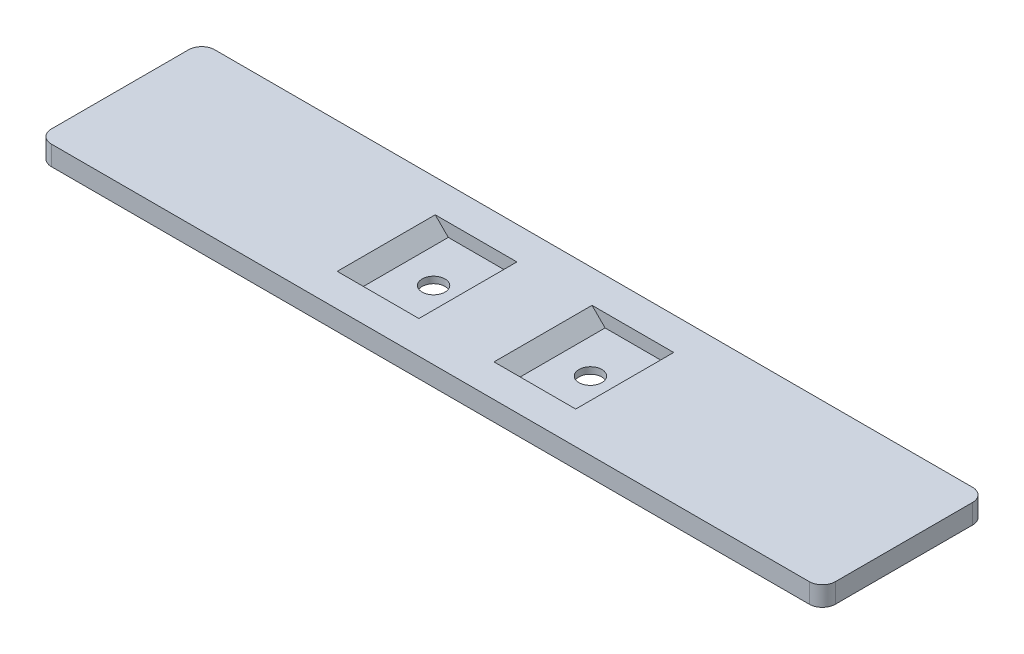
ISO-10303-21;
HEADER;
FILE_DESCRIPTION(('STEP AP214'),'2;1');
FILE_NAME('part.step','',(''),(''),'','','');
FILE_SCHEMA(('AUTOMOTIVE_DESIGN { 1 0 10303 214 1 1 1 1 }'));
ENDSEC;
DATA;
#1=APPLICATION_CONTEXT('core data for automotive mechanical design processes');
#2=APPLICATION_PROTOCOL_DEFINITION('international standard','automotive_design',2000,#1);
#3=PRODUCT_CONTEXT('',#1,'mechanical');
#4=PRODUCT('Part','Part','',(#3));
#5=PRODUCT_RELATED_PRODUCT_CATEGORY('part','',(#4));
#6=PRODUCT_DEFINITION_FORMATION('','',#4);
#7=PRODUCT_DEFINITION_CONTEXT('part definition',#1,'design');
#8=PRODUCT_DEFINITION('design','',#6,#7);
#9=PRODUCT_DEFINITION_SHAPE('','',#8);
#10=(LENGTH_UNIT() NAMED_UNIT(*) SI_UNIT(.MILLI.,.METRE.));
#11=(NAMED_UNIT(*) PLANE_ANGLE_UNIT() SI_UNIT($,.RADIAN.));
#12=(NAMED_UNIT(*) SI_UNIT($,.STERADIAN.) SOLID_ANGLE_UNIT());
#13=UNCERTAINTY_MEASURE_WITH_UNIT(LENGTH_MEASURE(1.E-05),#10,'distance_accuracy_value','');
#14=(GEOMETRIC_REPRESENTATION_CONTEXT(3) GLOBAL_UNCERTAINTY_ASSIGNED_CONTEXT((#13)) GLOBAL_UNIT_ASSIGNED_CONTEXT((#10,
#11,#12)) REPRESENTATION_CONTEXT('',''));
#15=CARTESIAN_POINT('',(0.,0.,0.));
#16=DIRECTION('',(0.,0.,1.));
#17=DIRECTION('',(1.,0.,0.));
#18=AXIS2_PLACEMENT_3D('',#15,#16,#17);
#19=CARTESIAN_POINT('',(-17.25,1.,7.5));
#20=DIRECTION('',(0.,0.,1.));
#21=DIRECTION('',(1.,0.,0.));
#22=AXIS2_PLACEMENT_3D('',#19,#20,#21);
#23=PLANE('',#22);
#24=DIRECTION('',(0.707106781186546,-0.70710678118655,0.));
#25=VECTOR('',#24,1.);
#26=CARTESIAN_POINT('',(-19.25,3.,7.5));
#27=LINE('',#26,#25);
#28=CARTESIAN_POINT('',(-19.25,3.,7.5));
#29=VERTEX_POINT('',#28);
#30=CARTESIAN_POINT('',(-17.25,1.,7.5));
#31=VERTEX_POINT('',#30);
#32=EDGE_CURVE('E50',#29,#31,#27,.T.);
#33=ORIENTED_EDGE('',*,*,#32,.F.);
#34=DIRECTION('',(1.,0.,0.));
#35=VECTOR('',#34,1.);
#36=CARTESIAN_POINT('',(-17.25,3.,7.5));
#37=LINE('',#36,#35);
#38=CARTESIAN_POINT('',(-6.75,3.,7.5));
#39=VERTEX_POINT('',#38);
#40=EDGE_CURVE('E191',#29,#39,#37,.T.);
#41=ORIENTED_EDGE('',*,*,#40,.T.);
#42=DIRECTION('',(0.,1.,0.));
#43=VECTOR('',#42,1.);
#44=CARTESIAN_POINT('',(-6.75,1.,7.5));
#45=LINE('',#44,#43);
#46=CARTESIAN_POINT('',(-6.75,1.,7.5));
#47=VERTEX_POINT('',#46);
#48=EDGE_CURVE('E200',#47,#39,#45,.T.);
#49=ORIENTED_EDGE('',*,*,#48,.F.);
#50=DIRECTION('',(1.,0.,0.));
#51=VECTOR('',#50,1.);
#52=CARTESIAN_POINT('',(-17.25,1.,7.5));
#53=LINE('',#52,#51);
#54=EDGE_CURVE('E194',#31,#47,#53,.T.);
#55=ORIENTED_EDGE('',*,*,#54,.F.);
#56=EDGE_LOOP('',(#33,#41,#49,#55));
#57=FACE_BOUND('',#56,.T.);
#58=ADVANCED_FACE('F35',(#57),#23,.F.);
#59=CARTESIAN_POINT('',(-17.25,1.,-7.5));
#60=DIRECTION('',(0.,0.,-1.));
#61=DIRECTION('',(-1.,0.,0.));
#62=AXIS2_PLACEMENT_3D('',#59,#60,#61);
#63=PLANE('',#62);
#64=DIRECTION('',(0.707106781186546,-0.70710678118655,0.));
#65=VECTOR('',#64,1.);
#66=CARTESIAN_POINT('',(-19.25,3.,-7.5));
#67=LINE('',#66,#65);
#68=CARTESIAN_POINT('',(-19.25,3.,-7.5));
#69=VERTEX_POINT('',#68);
#70=CARTESIAN_POINT('',(-17.25,1.,-7.5));
#71=VERTEX_POINT('',#70);
#72=EDGE_CURVE('E344',#69,#71,#67,.T.);
#73=ORIENTED_EDGE('',*,*,#72,.T.);
#74=DIRECTION('',(-1.,0.,0.));
#75=VECTOR('',#74,1.);
#76=CARTESIAN_POINT('',(-17.25,1.,-7.5));
#77=LINE('',#76,#75);
#78=CARTESIAN_POINT('',(-6.75,1.,-7.5));
#79=VERTEX_POINT('',#78);
#80=EDGE_CURVE('E190',#79,#71,#77,.T.);
#81=ORIENTED_EDGE('',*,*,#80,.F.);
#82=DIRECTION('',(0.,1.,0.));
#83=VECTOR('',#82,1.);
#84=CARTESIAN_POINT('',(-6.75,1.,-7.5));
#85=LINE('',#84,#83);
#86=CARTESIAN_POINT('',(-6.75,3.,-7.5));
#87=VERTEX_POINT('',#86);
#88=EDGE_CURVE('E196',#79,#87,#85,.T.);
#89=ORIENTED_EDGE('',*,*,#88,.T.);
#90=DIRECTION('',(-1.,0.,0.));
#91=VECTOR('',#90,1.);
#92=CARTESIAN_POINT('',(-17.25,3.,-7.5));
#93=LINE('',#92,#91);
#94=EDGE_CURVE('E58',#87,#69,#93,.T.);
#95=ORIENTED_EDGE('',*,*,#94,.T.);
#96=EDGE_LOOP('',(#73,#81,#89,#95));
#97=FACE_BOUND('',#96,.T.);
#98=ADVANCED_FACE('F318',(#97),#63,.F.);
#99=CARTESIAN_POINT('',(0.,1.,0.));
#100=DIRECTION('',(0.,1.,0.));
#101=DIRECTION('',(0.,0.,1.));
#102=AXIS2_PLACEMENT_3D('',#99,#100,#101);
#103=PLANE('',#102);
#104=CARTESIAN_POINT('',(-12.,1.,0.));
#105=DIRECTION('',(0.,1.,0.));
#106=DIRECTION('',(0.,0.,1.));
#107=AXIS2_PLACEMENT_3D('',#104,#105,#106);
#108=CIRCLE('',#107,1.75);
#109=CARTESIAN_POINT('',(-12.,1.,1.75));
#110=VERTEX_POINT('',#109);
#111=EDGE_CURVE('E183',#110,#110,#108,.T.);
#112=ORIENTED_EDGE('',*,*,#111,.F.);
#113=EDGE_LOOP('',(#112));
#114=FACE_BOUND('',#113,.T.);
#115=ORIENTED_EDGE('',*,*,#80,.T.);
#116=DIRECTION('',(0.,0.,1.));
#117=VECTOR('',#116,1.);
#118=CARTESIAN_POINT('',(-17.25,1.,-11.105551275464));
#119=LINE('',#118,#117);
#120=EDGE_CURVE('E341',#71,#31,#119,.T.);
#121=ORIENTED_EDGE('',*,*,#120,.T.);
#122=ORIENTED_EDGE('',*,*,#54,.T.);
#123=DIRECTION('',(0.,0.,-1.));
#124=VECTOR('',#123,1.);
#125=CARTESIAN_POINT('',(-6.75,1.,-7.5));
#126=LINE('',#125,#124);
#127=EDGE_CURVE('E187',#47,#79,#126,.T.);
#128=ORIENTED_EDGE('',*,*,#127,.T.);
#129=EDGE_LOOP('',(#115,#121,#122,#128));
#130=FACE_BOUND('',#129,.T.);
#131=ADVANCED_FACE('F323',(#114,#130),#103,.T.);
#132=CARTESIAN_POINT('',(17.25,1.,7.5));
#133=DIRECTION('',(0.,0.,1.));
#134=DIRECTION('',(1.,0.,0.));
#135=AXIS2_PLACEMENT_3D('',#132,#133,#134);
#136=PLANE('',#135);
#137=DIRECTION('',(0.707106781186551,-0.707106781186544,0.));
#138=VECTOR('',#137,1.);
#139=CARTESIAN_POINT('',(4.74999999999998,3.,7.5));
#140=LINE('',#139,#138);
#141=CARTESIAN_POINT('',(4.74999999999998,3.,7.5));
#142=VERTEX_POINT('',#141);
#143=CARTESIAN_POINT('',(6.75,1.,7.5));
#144=VERTEX_POINT('',#143);
#145=EDGE_CURVE('E353',#142,#144,#140,.T.);
#146=ORIENTED_EDGE('',*,*,#145,.F.);
#147=DIRECTION('',(1.,0.,0.));
#148=VECTOR('',#147,1.);
#149=CARTESIAN_POINT('',(17.25,3.,7.5));
#150=LINE('',#149,#148);
#151=CARTESIAN_POINT('',(17.25,3.,7.5));
#152=VERTEX_POINT('',#151);
#153=EDGE_CURVE('E173',#142,#152,#150,.T.);
#154=ORIENTED_EDGE('',*,*,#153,.T.);
#155=DIRECTION('',(0.,1.,0.));
#156=VECTOR('',#155,1.);
#157=CARTESIAN_POINT('',(17.25,1.,7.5));
#158=LINE('',#157,#156);
#159=CARTESIAN_POINT('',(17.25,1.,7.5));
#160=VERTEX_POINT('',#159);
#161=EDGE_CURVE('E159',#160,#152,#158,.T.);
#162=ORIENTED_EDGE('',*,*,#161,.F.);
#163=DIRECTION('',(1.,0.,0.));
#164=VECTOR('',#163,1.);
#165=CARTESIAN_POINT('',(17.25,1.,7.5));
#166=LINE('',#165,#164);
#167=EDGE_CURVE('E160',#144,#160,#166,.T.);
#168=ORIENTED_EDGE('',*,*,#167,.F.);
#169=EDGE_LOOP('',(#146,#154,#162,#168));
#170=FACE_BOUND('',#169,.T.);
#171=ADVANCED_FACE('F375',(#170),#136,.F.);
#172=CARTESIAN_POINT('',(17.25,1.,-7.5));
#173=DIRECTION('',(0.,0.,-1.));
#174=DIRECTION('',(-1.,0.,0.));
#175=AXIS2_PLACEMENT_3D('',#172,#173,#174);
#176=PLANE('',#175);
#177=DIRECTION('',(0.707106781186551,-0.707106781186544,0.));
#178=VECTOR('',#177,1.);
#179=CARTESIAN_POINT('',(4.74999999999998,3.,-7.5));
#180=LINE('',#179,#178);
#181=CARTESIAN_POINT('',(4.74999999999998,3.,-7.5));
#182=VERTEX_POINT('',#181);
#183=CARTESIAN_POINT('',(6.75,1.,-7.5));
#184=VERTEX_POINT('',#183);
#185=EDGE_CURVE('E166',#182,#184,#180,.T.);
#186=ORIENTED_EDGE('',*,*,#185,.T.);
#187=DIRECTION('',(-1.,0.,0.));
#188=VECTOR('',#187,1.);
#189=CARTESIAN_POINT('',(17.25,1.,-7.5));
#190=LINE('',#189,#188);
#191=CARTESIAN_POINT('',(17.25,1.,-7.5));
#192=VERTEX_POINT('',#191);
#193=EDGE_CURVE('E163',#192,#184,#190,.T.);
#194=ORIENTED_EDGE('',*,*,#193,.F.);
#195=DIRECTION('',(0.,1.,0.));
#196=VECTOR('',#195,1.);
#197=CARTESIAN_POINT('',(17.25,1.,-7.5));
#198=LINE('',#197,#196);
#199=CARTESIAN_POINT('',(17.25,3.,-7.5));
#200=VERTEX_POINT('',#199);
#201=EDGE_CURVE('E149',#192,#200,#198,.T.);
#202=ORIENTED_EDGE('',*,*,#201,.T.);
#203=DIRECTION('',(-1.,0.,0.));
#204=VECTOR('',#203,1.);
#205=CARTESIAN_POINT('',(17.25,3.,-7.5));
#206=LINE('',#205,#204);
#207=EDGE_CURVE('E175',#200,#182,#206,.T.);
#208=ORIENTED_EDGE('',*,*,#207,.T.);
#209=EDGE_LOOP('',(#186,#194,#202,#208));
#210=FACE_BOUND('',#209,.T.);
#211=ADVANCED_FACE('F164',(#210),#176,.F.);
#212=CARTESIAN_POINT('',(0.,1.,0.));
#213=DIRECTION('',(0.,-1.,0.));
#214=DIRECTION('',(0.,0.,-1.));
#215=AXIS2_PLACEMENT_3D('',#212,#213,#214);
#216=PLANE('',#215);
#217=CARTESIAN_POINT('',(12.,1.,0.));
#218=DIRECTION('',(0.,-1.,0.));
#219=DIRECTION('',(0.,0.,-1.));
#220=AXIS2_PLACEMENT_3D('',#217,#218,#219);
#221=CIRCLE('',#220,1.75);
#222=CARTESIAN_POINT('',(12.,1.,-1.75));
#223=VERTEX_POINT('',#222);
#224=EDGE_CURVE('E229',#223,#223,#221,.T.);
#225=ORIENTED_EDGE('',*,*,#224,.T.);
#226=EDGE_LOOP('',(#225));
#227=FACE_BOUND('',#226,.T.);
#228=DIRECTION('',(0.,0.,1.));
#229=VECTOR('',#228,1.);
#230=CARTESIAN_POINT('',(6.75,1.,-11.105551275464));
#231=LINE('',#230,#229);
#232=EDGE_CURVE('E346',#184,#144,#231,.T.);
#233=ORIENTED_EDGE('',*,*,#232,.T.);
#234=ORIENTED_EDGE('',*,*,#167,.T.);
#235=DIRECTION('',(0.,0.,-1.));
#236=VECTOR('',#235,1.);
#237=CARTESIAN_POINT('',(17.25,1.,-7.5));
#238=LINE('',#237,#236);
#239=EDGE_CURVE('E154',#160,#192,#238,.T.);
#240=ORIENTED_EDGE('',*,*,#239,.T.);
#241=ORIENTED_EDGE('',*,*,#193,.T.);
#242=EDGE_LOOP('',(#233,#234,#240,#241));
#243=FACE_BOUND('',#242,.T.);
#244=ADVANCED_FACE('F170',(#227,#243),#216,.F.);
#245=CARTESIAN_POINT('',(-58.,3.,-10.5));
#246=DIRECTION('',(0.,1.,0.));
#247=DIRECTION('',(0.,0.,1.));
#248=AXIS2_PLACEMENT_3D('',#245,#246,#247);
#249=CYLINDRICAL_SURFACE('',#248,2.);
#250=DIRECTION('',(0.,1.,0.));
#251=VECTOR('',#250,1.);
#252=CARTESIAN_POINT('',(-58.,3.,-12.5));
#253=LINE('',#252,#251);
#254=CARTESIAN_POINT('',(-58.,0.,-12.5));
#255=VERTEX_POINT('',#254);
#256=CARTESIAN_POINT('',(-58.,3.,-12.5));
#257=VERTEX_POINT('',#256);
#258=EDGE_CURVE('E263',#255,#257,#253,.T.);
#259=ORIENTED_EDGE('',*,*,#258,.F.);
#260=CARTESIAN_POINT('',(-58.,0.,-10.5));
#261=DIRECTION('',(0.,1.,0.));
#262=DIRECTION('',(0.,0.,1.));
#263=AXIS2_PLACEMENT_3D('',#260,#261,#262);
#264=CIRCLE('',#263,2.);
#265=CARTESIAN_POINT('',(-60.,0.,-10.5));
#266=VERTEX_POINT('',#265);
#267=EDGE_CURVE('E43',#266,#255,#264,.F.);
#268=ORIENTED_EDGE('',*,*,#267,.F.);
#269=DIRECTION('',(0.,1.,0.));
#270=VECTOR('',#269,1.);
#271=CARTESIAN_POINT('',(-60.,3.,-10.5));
#272=LINE('',#271,#270);
#273=CARTESIAN_POINT('',(-60.,3.,-10.5));
#274=VERTEX_POINT('',#273);
#275=EDGE_CURVE('E266',#274,#266,#272,.F.);
#276=ORIENTED_EDGE('',*,*,#275,.F.);
#277=CARTESIAN_POINT('',(-58.,3.,-10.5));
#278=DIRECTION('',(0.,1.,0.));
#279=DIRECTION('',(0.,0.,1.));
#280=AXIS2_PLACEMENT_3D('',#277,#278,#279);
#281=CIRCLE('',#280,2.);
#282=EDGE_CURVE('E11',#257,#274,#281,.T.);
#283=ORIENTED_EDGE('',*,*,#282,.F.);
#284=EDGE_LOOP('',(#259,#268,#276,#283));
#285=FACE_BOUND('',#284,.T.);
#286=ADVANCED_FACE('F37',(#285),#249,.T.);
#287=CARTESIAN_POINT('',(58.,3.,-10.5));
#288=DIRECTION('',(0.,1.,0.));
#289=DIRECTION('',(0.,0.,1.));
#290=AXIS2_PLACEMENT_3D('',#287,#288,#289);
#291=CYLINDRICAL_SURFACE('',#290,2.);
#292=DIRECTION('',(0.,1.,0.));
#293=VECTOR('',#292,1.);
#294=CARTESIAN_POINT('',(60.,3.,-10.5));
#295=LINE('',#294,#293);
#296=CARTESIAN_POINT('',(60.,0.,-10.5));
#297=VERTEX_POINT('',#296);
#298=CARTESIAN_POINT('',(60.,3.,-10.5));
#299=VERTEX_POINT('',#298);
#300=EDGE_CURVE('E253',#297,#299,#295,.T.);
#301=ORIENTED_EDGE('',*,*,#300,.F.);
#302=CARTESIAN_POINT('',(58.,0.,-10.5));
#303=DIRECTION('',(0.,1.,0.));
#304=DIRECTION('',(0.,0.,1.));
#305=AXIS2_PLACEMENT_3D('',#302,#303,#304);
#306=CIRCLE('',#305,2.);
#307=CARTESIAN_POINT('',(58.,0.,-12.5));
#308=VERTEX_POINT('',#307);
#309=EDGE_CURVE('E259',#308,#297,#306,.F.);
#310=ORIENTED_EDGE('',*,*,#309,.F.);
#311=DIRECTION('',(0.,1.,0.));
#312=VECTOR('',#311,1.);
#313=CARTESIAN_POINT('',(58.,3.,-12.5));
#314=LINE('',#313,#312);
#315=CARTESIAN_POINT('',(58.,3.,-12.5));
#316=VERTEX_POINT('',#315);
#317=EDGE_CURVE('E256',#316,#308,#314,.F.);
#318=ORIENTED_EDGE('',*,*,#317,.F.);
#319=CARTESIAN_POINT('',(58.,3.,-10.5));
#320=DIRECTION('',(0.,1.,0.));
#321=DIRECTION('',(0.,0.,1.));
#322=AXIS2_PLACEMENT_3D('',#319,#320,#321);
#323=CIRCLE('',#322,2.);
#324=EDGE_CURVE('E261',#299,#316,#323,.T.);
#325=ORIENTED_EDGE('',*,*,#324,.F.);
#326=EDGE_LOOP('',(#301,#310,#318,#325));
#327=FACE_BOUND('',#326,.T.);
#328=ADVANCED_FACE('F281',(#327),#291,.T.);
#329=CARTESIAN_POINT('',(58.,3.,10.5));
#330=DIRECTION('',(0.,1.,0.));
#331=DIRECTION('',(0.,0.,1.));
#332=AXIS2_PLACEMENT_3D('',#329,#330,#331);
#333=CYLINDRICAL_SURFACE('',#332,2.);
#334=DIRECTION('',(0.,1.,0.));
#335=VECTOR('',#334,1.);
#336=CARTESIAN_POINT('',(58.,3.,12.5));
#337=LINE('',#336,#335);
#338=CARTESIAN_POINT('',(58.,0.,12.5));
#339=VERTEX_POINT('',#338);
#340=CARTESIAN_POINT('',(58.,3.,12.5));
#341=VERTEX_POINT('',#340);
#342=EDGE_CURVE('E243',#339,#341,#337,.T.);
#343=ORIENTED_EDGE('',*,*,#342,.F.);
#344=CARTESIAN_POINT('',(58.,0.,10.5));
#345=DIRECTION('',(0.,1.,0.));
#346=DIRECTION('',(0.,0.,1.));
#347=AXIS2_PLACEMENT_3D('',#344,#345,#346);
#348=CIRCLE('',#347,2.);
#349=CARTESIAN_POINT('',(60.,0.,10.5));
#350=VERTEX_POINT('',#349);
#351=EDGE_CURVE('E249',#350,#339,#348,.F.);
#352=ORIENTED_EDGE('',*,*,#351,.F.);
#353=DIRECTION('',(0.,1.,0.));
#354=VECTOR('',#353,1.);
#355=CARTESIAN_POINT('',(60.,3.,10.5));
#356=LINE('',#355,#354);
#357=CARTESIAN_POINT('',(60.,3.,10.5));
#358=VERTEX_POINT('',#357);
#359=EDGE_CURVE('E246',#358,#350,#356,.F.);
#360=ORIENTED_EDGE('',*,*,#359,.F.);
#361=CARTESIAN_POINT('',(58.,3.,10.5));
#362=DIRECTION('',(0.,1.,0.));
#363=DIRECTION('',(0.,0.,1.));
#364=AXIS2_PLACEMENT_3D('',#361,#362,#363);
#365=CIRCLE('',#364,2.);
#366=EDGE_CURVE('E251',#341,#358,#365,.T.);
#367=ORIENTED_EDGE('',*,*,#366,.F.);
#368=EDGE_LOOP('',(#343,#352,#360,#367));
#369=FACE_BOUND('',#368,.T.);
#370=ADVANCED_FACE('F290',(#369),#333,.T.);
#371=CARTESIAN_POINT('',(-58.,3.,10.5));
#372=DIRECTION('',(0.,1.,0.));
#373=DIRECTION('',(0.,0.,1.));
#374=AXIS2_PLACEMENT_3D('',#371,#372,#373);
#375=CYLINDRICAL_SURFACE('',#374,2.);
#376=DIRECTION('',(0.,1.,0.));
#377=VECTOR('',#376,1.);
#378=CARTESIAN_POINT('',(-60.,3.,10.5));
#379=LINE('',#378,#377);
#380=CARTESIAN_POINT('',(-60.,0.,10.5));
#381=VERTEX_POINT('',#380);
#382=CARTESIAN_POINT('',(-60.,3.,10.5));
#383=VERTEX_POINT('',#382);
#384=EDGE_CURVE('E217',#381,#383,#379,.T.);
#385=ORIENTED_EDGE('',*,*,#384,.F.);
#386=CARTESIAN_POINT('',(-58.,0.,10.5));
#387=DIRECTION('',(0.,1.,0.));
#388=DIRECTION('',(0.,0.,1.));
#389=AXIS2_PLACEMENT_3D('',#386,#387,#388);
#390=CIRCLE('',#389,2.);
#391=CARTESIAN_POINT('',(-58.,0.,12.5));
#392=VERTEX_POINT('',#391);
#393=EDGE_CURVE('E238',#392,#381,#390,.F.);
#394=ORIENTED_EDGE('',*,*,#393,.F.);
#395=DIRECTION('',(0.,1.,0.));
#396=VECTOR('',#395,1.);
#397=CARTESIAN_POINT('',(-58.,3.,12.5));
#398=LINE('',#397,#396);
#399=CARTESIAN_POINT('',(-58.,3.,12.5));
#400=VERTEX_POINT('',#399);
#401=EDGE_CURVE('E235',#400,#392,#398,.F.);
#402=ORIENTED_EDGE('',*,*,#401,.F.);
#403=CARTESIAN_POINT('',(-58.,3.,10.5));
#404=DIRECTION('',(0.,1.,0.));
#405=DIRECTION('',(0.,0.,1.));
#406=AXIS2_PLACEMENT_3D('',#403,#404,#405);
#407=CIRCLE('',#406,2.);
#408=EDGE_CURVE('E241',#383,#400,#407,.T.);
#409=ORIENTED_EDGE('',*,*,#408,.F.);
#410=EDGE_LOOP('',(#385,#394,#402,#409));
#411=FACE_BOUND('',#410,.T.);
#412=ADVANCED_FACE('F298',(#411),#375,.T.);
#413=CARTESIAN_POINT('',(-60.,3.,12.5));
#414=DIRECTION('',(1.,0.,0.));
#415=DIRECTION('',(0.,0.,-1.));
#416=AXIS2_PLACEMENT_3D('',#413,#414,#415);
#417=PLANE('',#416);
#418=DIRECTION('',(0.,0.,1.));
#419=VECTOR('',#418,1.);
#420=CARTESIAN_POINT('',(-60.,3.,12.5));
#421=LINE('',#420,#419);
#422=EDGE_CURVE('E205',#274,#383,#421,.T.);
#423=ORIENTED_EDGE('',*,*,#422,.F.);
#424=ORIENTED_EDGE('',*,*,#275,.T.);
#425=DIRECTION('',(0.,0.,1.));
#426=VECTOR('',#425,1.);
#427=CARTESIAN_POINT('',(-60.,0.,12.5));
#428=LINE('',#427,#426);
#429=EDGE_CURVE('E203',#266,#381,#428,.T.);
#430=ORIENTED_EDGE('',*,*,#429,.T.);
#431=ORIENTED_EDGE('',*,*,#384,.T.);
#432=EDGE_LOOP('',(#423,#424,#430,#431));
#433=FACE_BOUND('',#432,.T.);
#434=ADVANCED_FACE('F301',(#433),#417,.F.);
#435=CARTESIAN_POINT('',(60.,3.,12.5));
#436=DIRECTION('',(0.,0.,-1.));
#437=DIRECTION('',(-1.,0.,0.));
#438=AXIS2_PLACEMENT_3D('',#435,#436,#437);
#439=PLANE('',#438);
#440=DIRECTION('',(1.,0.,0.));
#441=VECTOR('',#440,1.);
#442=CARTESIAN_POINT('',(60.,0.,12.5));
#443=LINE('',#442,#441);
#444=EDGE_CURVE('E219',#392,#339,#443,.T.);
#445=ORIENTED_EDGE('',*,*,#444,.T.);
#446=ORIENTED_EDGE('',*,*,#342,.T.);
#447=DIRECTION('',(1.,0.,0.));
#448=VECTOR('',#447,1.);
#449=CARTESIAN_POINT('',(60.,3.,12.5));
#450=LINE('',#449,#448);
#451=EDGE_CURVE('E207',#400,#341,#450,.T.);
#452=ORIENTED_EDGE('',*,*,#451,.F.);
#453=ORIENTED_EDGE('',*,*,#401,.T.);
#454=EDGE_LOOP('',(#445,#446,#452,#453));
#455=FACE_BOUND('',#454,.T.);
#456=ADVANCED_FACE('F293',(#455),#439,.F.);
#457=CARTESIAN_POINT('',(60.,3.,12.5));
#458=DIRECTION('',(-1.,0.,0.));
#459=DIRECTION('',(0.,0.,1.));
#460=AXIS2_PLACEMENT_3D('',#457,#458,#459);
#461=PLANE('',#460);
#462=DIRECTION('',(0.,0.,-1.));
#463=VECTOR('',#462,1.);
#464=CARTESIAN_POINT('',(60.,0.,12.5));
#465=LINE('',#464,#463);
#466=EDGE_CURVE('E222',#350,#297,#465,.T.);
#467=ORIENTED_EDGE('',*,*,#466,.T.);
#468=ORIENTED_EDGE('',*,*,#300,.T.);
#469=DIRECTION('',(0.,0.,-1.));
#470=VECTOR('',#469,1.);
#471=CARTESIAN_POINT('',(60.,3.,12.5));
#472=LINE('',#471,#470);
#473=EDGE_CURVE('E211',#358,#299,#472,.T.);
#474=ORIENTED_EDGE('',*,*,#473,.F.);
#475=ORIENTED_EDGE('',*,*,#359,.T.);
#476=EDGE_LOOP('',(#467,#468,#474,#475));
#477=FACE_BOUND('',#476,.T.);
#478=ADVANCED_FACE('F286',(#477),#461,.F.);
#479=CARTESIAN_POINT('',(60.,3.,-12.5));
#480=DIRECTION('',(0.,0.,1.));
#481=DIRECTION('',(1.,0.,0.));
#482=AXIS2_PLACEMENT_3D('',#479,#480,#481);
#483=PLANE('',#482);
#484=DIRECTION('',(-1.,0.,0.));
#485=VECTOR('',#484,1.);
#486=CARTESIAN_POINT('',(60.,0.,-12.5));
#487=LINE('',#486,#485);
#488=EDGE_CURVE('E208',#308,#255,#487,.T.);
#489=ORIENTED_EDGE('',*,*,#488,.T.);
#490=ORIENTED_EDGE('',*,*,#258,.T.);
#491=DIRECTION('',(-1.,0.,0.));
#492=VECTOR('',#491,1.);
#493=CARTESIAN_POINT('',(60.,3.,-12.5));
#494=LINE('',#493,#492);
#495=EDGE_CURVE('E214',#316,#257,#494,.T.);
#496=ORIENTED_EDGE('',*,*,#495,.F.);
#497=ORIENTED_EDGE('',*,*,#317,.T.);
#498=EDGE_LOOP('',(#489,#490,#496,#497));
#499=FACE_BOUND('',#498,.T.);
#500=ADVANCED_FACE('F277',(#499),#483,.F.);
#501=CARTESIAN_POINT('',(0.,3.,0.));
#502=DIRECTION('',(0.,1.,0.));
#503=DIRECTION('',(0.,0.,1.));
#504=AXIS2_PLACEMENT_3D('',#501,#502,#503);
#505=PLANE('',#504);
#506=ORIENTED_EDGE('',*,*,#40,.F.);
#507=DIRECTION('',(0.,0.,1.));
#508=VECTOR('',#507,1.);
#509=CARTESIAN_POINT('',(-19.25,3.,-11.105551275464));
#510=LINE('',#509,#508);
#511=EDGE_CURVE('E338',#69,#29,#510,.T.);
#512=ORIENTED_EDGE('',*,*,#511,.F.);
#513=ORIENTED_EDGE('',*,*,#94,.F.);
#514=DIRECTION('',(0.,0.,-1.));
#515=VECTOR('',#514,1.);
#516=CARTESIAN_POINT('',(-6.75,3.,-7.5));
#517=LINE('',#516,#515);
#518=EDGE_CURVE('E185',#39,#87,#517,.T.);
#519=ORIENTED_EDGE('',*,*,#518,.F.);
#520=EDGE_LOOP('',(#506,#512,#513,#519));
#521=FACE_BOUND('',#520,.T.);
#522=ORIENTED_EDGE('',*,*,#153,.F.);
#523=DIRECTION('',(0.,0.,1.));
#524=VECTOR('',#523,1.);
#525=CARTESIAN_POINT('',(4.74999999999998,3.,-11.105551275464));
#526=LINE('',#525,#524);
#527=EDGE_CURVE('E348',#182,#142,#526,.T.);
#528=ORIENTED_EDGE('',*,*,#527,.F.);
#529=ORIENTED_EDGE('',*,*,#207,.F.);
#530=DIRECTION('',(0.,0.,-1.));
#531=VECTOR('',#530,1.);
#532=CARTESIAN_POINT('',(17.25,3.,-7.5));
#533=LINE('',#532,#531);
#534=EDGE_CURVE('E156',#152,#200,#533,.T.);
#535=ORIENTED_EDGE('',*,*,#534,.F.);
#536=EDGE_LOOP('',(#522,#528,#529,#535));
#537=FACE_BOUND('',#536,.T.);
#538=ORIENTED_EDGE('',*,*,#495,.T.);
#539=ORIENTED_EDGE('',*,*,#282,.T.);
#540=ORIENTED_EDGE('',*,*,#422,.T.);
#541=ORIENTED_EDGE('',*,*,#408,.T.);
#542=ORIENTED_EDGE('',*,*,#451,.T.);
#543=ORIENTED_EDGE('',*,*,#366,.T.);
#544=ORIENTED_EDGE('',*,*,#473,.T.);
#545=ORIENTED_EDGE('',*,*,#324,.T.);
#546=EDGE_LOOP('',(#538,#539,#540,#541,#542,#543,#544,#545));
#547=FACE_BOUND('',#546,.T.);
#548=ADVANCED_FACE('F303',(#521,#537,#547),#505,.T.);
#549=CARTESIAN_POINT('',(0.,0.,0.));
#550=DIRECTION('',(0.,1.,0.));
#551=DIRECTION('',(0.,0.,1.));
#552=AXIS2_PLACEMENT_3D('',#549,#550,#551);
#553=PLANE('',#552);
#554=CARTESIAN_POINT('',(12.,0.,0.));
#555=DIRECTION('',(0.,1.,0.));
#556=DIRECTION('',(0.,0.,-1.));
#557=AXIS2_PLACEMENT_3D('',#554,#555,#556);
#558=CIRCLE('',#557,1.75);
#559=CARTESIAN_POINT('',(12.,0.,-1.75));
#560=VERTEX_POINT('',#559);
#561=EDGE_CURVE('E232',#560,#560,#558,.T.);
#562=ORIENTED_EDGE('',*,*,#561,.T.);
#563=EDGE_LOOP('',(#562));
#564=FACE_BOUND('',#563,.T.);
#565=CARTESIAN_POINT('',(-12.,0.,0.));
#566=DIRECTION('',(0.,1.,0.));
#567=DIRECTION('',(0.,0.,1.));
#568=AXIS2_PLACEMENT_3D('',#565,#566,#567);
#569=CIRCLE('',#568,1.75);
#570=CARTESIAN_POINT('',(-12.,0.,1.75));
#571=VERTEX_POINT('',#570);
#572=EDGE_CURVE('E178',#571,#571,#569,.T.);
#573=ORIENTED_EDGE('',*,*,#572,.T.);
#574=EDGE_LOOP('',(#573));
#575=FACE_BOUND('',#574,.T.);
#576=ORIENTED_EDGE('',*,*,#429,.F.);
#577=ORIENTED_EDGE('',*,*,#267,.T.);
#578=ORIENTED_EDGE('',*,*,#488,.F.);
#579=ORIENTED_EDGE('',*,*,#309,.T.);
#580=ORIENTED_EDGE('',*,*,#466,.F.);
#581=ORIENTED_EDGE('',*,*,#351,.T.);
#582=ORIENTED_EDGE('',*,*,#444,.F.);
#583=ORIENTED_EDGE('',*,*,#393,.T.);
#584=EDGE_LOOP('',(#576,#577,#578,#579,#580,#581,#582,#583));
#585=FACE_BOUND('',#584,.T.);
#586=ADVANCED_FACE('F272',(#564,#575,#585),#553,.F.);
#587=CARTESIAN_POINT('',(-6.75,1.,-7.5));
#588=DIRECTION('',(1.,0.,0.));
#589=DIRECTION('',(0.,0.,-1.));
#590=AXIS2_PLACEMENT_3D('',#587,#588,#589);
#591=PLANE('',#590);
#592=ORIENTED_EDGE('',*,*,#518,.T.);
#593=ORIENTED_EDGE('',*,*,#88,.F.);
#594=ORIENTED_EDGE('',*,*,#127,.F.);
#595=ORIENTED_EDGE('',*,*,#48,.T.);
#596=EDGE_LOOP('',(#592,#593,#594,#595));
#597=FACE_BOUND('',#596,.T.);
#598=ADVANCED_FACE('F311',(#597),#591,.F.);
#599=CARTESIAN_POINT('',(17.25,1.,-7.5));
#600=DIRECTION('',(1.,0.,0.));
#601=DIRECTION('',(0.,0.,-1.));
#602=AXIS2_PLACEMENT_3D('',#599,#600,#601);
#603=PLANE('',#602);
#604=ORIENTED_EDGE('',*,*,#534,.T.);
#605=ORIENTED_EDGE('',*,*,#201,.F.);
#606=ORIENTED_EDGE('',*,*,#239,.F.);
#607=ORIENTED_EDGE('',*,*,#161,.T.);
#608=EDGE_LOOP('',(#604,#605,#606,#607));
#609=FACE_BOUND('',#608,.T.);
#610=ADVANCED_FACE('F151',(#609),#603,.F.);
#611=CARTESIAN_POINT('',(-12.,0.,0.));
#612=DIRECTION('',(0.,1.,0.));
#613=DIRECTION('',(0.,0.,1.));
#614=AXIS2_PLACEMENT_3D('',#611,#612,#613);
#615=CYLINDRICAL_SURFACE('',#614,1.75);
#616=ORIENTED_EDGE('',*,*,#111,.T.);
#617=EDGE_LOOP('',(#616));
#618=FACE_BOUND('',#617,.T.);
#619=ORIENTED_EDGE('',*,*,#572,.F.);
#620=EDGE_LOOP('',(#619));
#621=FACE_BOUND('',#620,.T.);
#622=ADVANCED_FACE('F332',(#618,#621),#615,.F.);
#623=CARTESIAN_POINT('',(12.,0.,0.));
#624=DIRECTION('',(0.,1.,0.));
#625=DIRECTION('',(0.,0.,1.));
#626=AXIS2_PLACEMENT_3D('',#623,#624,#625);
#627=CYLINDRICAL_SURFACE('',#626,1.75);
#628=ORIENTED_EDGE('',*,*,#561,.F.);
#629=EDGE_LOOP('',(#628));
#630=FACE_BOUND('',#629,.T.);
#631=ORIENTED_EDGE('',*,*,#224,.F.);
#632=EDGE_LOOP('',(#631));
#633=FACE_BOUND('',#632,.T.);
#634=ADVANCED_FACE('F362',(#630,#633),#627,.F.);
#635=CARTESIAN_POINT('',(4.74999999999998,3.,-11.105551275464));
#636=DIRECTION('',(-0.707106781186544,-0.707106781186551,0.));
#637=DIRECTION('',(0.707106781186551,-0.707106781186544,0.));
#638=AXIS2_PLACEMENT_3D('',#635,#636,#637);
#639=PLANE('',#638);
#640=ORIENTED_EDGE('',*,*,#185,.F.);
#641=ORIENTED_EDGE('',*,*,#527,.T.);
#642=ORIENTED_EDGE('',*,*,#145,.T.);
#643=ORIENTED_EDGE('',*,*,#232,.F.);
#644=EDGE_LOOP('',(#640,#641,#642,#643));
#645=FACE_BOUND('',#644,.T.);
#646=ADVANCED_FACE('F365',(#645),#639,.F.);
#647=CARTESIAN_POINT('',(-19.25,3.,-11.105551275464));
#648=DIRECTION('',(-0.707106781186549,-0.707106781186545,0.));
#649=DIRECTION('',(0.707106781186546,-0.70710678118655,0.));
#650=AXIS2_PLACEMENT_3D('',#647,#648,#649);
#651=PLANE('',#650);
#652=ORIENTED_EDGE('',*,*,#72,.F.);
#653=ORIENTED_EDGE('',*,*,#511,.T.);
#654=ORIENTED_EDGE('',*,*,#32,.T.);
#655=ORIENTED_EDGE('',*,*,#120,.F.);
#656=EDGE_LOOP('',(#652,#653,#654,#655));
#657=FACE_BOUND('',#656,.T.);
#658=ADVANCED_FACE('F345',(#657),#651,.F.);
#659=CLOSED_SHELL('',(#58,#98,#131,#171,#211,#244,#286,#328,#370,#412,#434,#456,#478,#500,#548,
#586,#598,#610,#622,#634,#646,#658));
#660=MANIFOLD_SOLID_BREP('B2',#659);
#661=ADVANCED_BREP_SHAPE_REPRESENTATION('',(#18,#660),#14);
#662=SHAPE_DEFINITION_REPRESENTATION(#9,#661);
ENDSEC;
END-ISO-10303-21;
